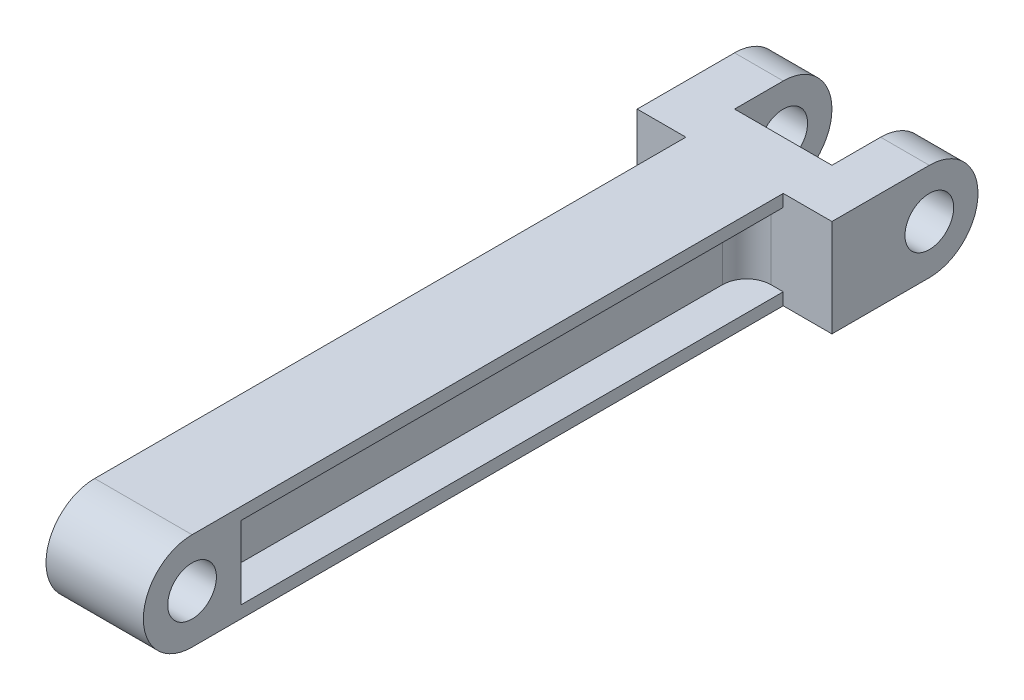
ISO-10303-21;
HEADER;
FILE_DESCRIPTION(('STEP AP214'),'2;1');
FILE_NAME('part.step','',(''),(''),'','','');
FILE_SCHEMA(('AUTOMOTIVE_DESIGN { 1 0 10303 214 1 1 1 1 }'));
ENDSEC;
DATA;
#1=APPLICATION_CONTEXT('core data for automotive mechanical design processes');
#2=APPLICATION_PROTOCOL_DEFINITION('international standard','automotive_design',2000,#1);
#3=PRODUCT_CONTEXT('',#1,'mechanical');
#4=PRODUCT('Part','Part','',(#3));
#5=PRODUCT_RELATED_PRODUCT_CATEGORY('part','',(#4));
#6=PRODUCT_DEFINITION_FORMATION('','',#4);
#7=PRODUCT_DEFINITION_CONTEXT('part definition',#1,'design');
#8=PRODUCT_DEFINITION('design','',#6,#7);
#9=PRODUCT_DEFINITION_SHAPE('','',#8);
#10=(LENGTH_UNIT() NAMED_UNIT(*) SI_UNIT(.MILLI.,.METRE.));
#11=(NAMED_UNIT(*) PLANE_ANGLE_UNIT() SI_UNIT($,.RADIAN.));
#12=(NAMED_UNIT(*) SI_UNIT($,.STERADIAN.) SOLID_ANGLE_UNIT());
#13=UNCERTAINTY_MEASURE_WITH_UNIT(LENGTH_MEASURE(1.E-05),#10,'distance_accuracy_value','');
#14=(GEOMETRIC_REPRESENTATION_CONTEXT(3) GLOBAL_UNCERTAINTY_ASSIGNED_CONTEXT((#13)) GLOBAL_UNIT_ASSIGNED_CONTEXT((#10,
#11,#12)) REPRESENTATION_CONTEXT('',''));
#15=CARTESIAN_POINT('',(0.,0.,0.));
#16=DIRECTION('',(0.,0.,1.));
#17=DIRECTION('',(1.,0.,0.));
#18=AXIS2_PLACEMENT_3D('',#15,#16,#17);
#19=CARTESIAN_POINT('',(0.,12.7,0.));
#20=DIRECTION('',(0.,-1.,0.));
#21=DIRECTION('',(0.,0.,-1.));
#22=AXIS2_PLACEMENT_3D('',#19,#20,#21);
#23=PLANE('',#22);
#24=DIRECTION('',(0.,0.,1.));
#25=VECTOR('',#24,1.);
#26=CARTESIAN_POINT('',(7.9375,12.7,0.));
#27=LINE('',#26,#25);
#28=CARTESIAN_POINT('',(7.9375,12.7,-89.8025612106915));
#29=VERTEX_POINT('',#28);
#30=CARTESIAN_POINT('',(7.9375,12.7,-83.4525612106915));
#31=VERTEX_POINT('',#30);
#32=EDGE_CURVE('E316',#29,#31,#27,.T.);
#33=ORIENTED_EDGE('',*,*,#32,.T.);
#34=DIRECTION('',(1.,0.,0.));
#35=VECTOR('',#34,1.);
#36=CARTESIAN_POINT('',(-11.1125,12.7,-83.4525612106915));
#37=LINE('',#36,#35);
#38=CARTESIAN_POINT('',(-4.7625,12.7,-83.4525612106915));
#39=VERTEX_POINT('',#38);
#40=EDGE_CURVE('E429',#39,#31,#37,.T.);
#41=ORIENTED_EDGE('',*,*,#40,.F.);
#42=DIRECTION('',(0.,0.,1.));
#43=VECTOR('',#42,1.);
#44=CARTESIAN_POINT('',(-4.7625,12.7,0.));
#45=LINE('',#44,#43);
#46=CARTESIAN_POINT('',(-4.7625,12.7,-89.8025612106915));
#47=VERTEX_POINT('',#46);
#48=EDGE_CURVE('E390',#47,#39,#45,.T.);
#49=ORIENTED_EDGE('',*,*,#48,.F.);
#50=DIRECTION('',(1.,0.,0.));
#51=VECTOR('',#50,1.);
#52=CARTESIAN_POINT('',(-29.0730122421383,12.7,-89.8025612106915));
#53=LINE('',#52,#51);
#54=CARTESIAN_POINT('',(-11.1125,12.7,-89.8025612106915));
#55=VERTEX_POINT('',#54);
#56=EDGE_CURVE('E373',#55,#47,#53,.T.);
#57=ORIENTED_EDGE('',*,*,#56,.F.);
#58=DIRECTION('',(0.,0.,1.));
#59=VECTOR('',#58,1.);
#60=CARTESIAN_POINT('',(-11.1125,12.7,0.));
#61=LINE('',#60,#59);
#62=CARTESIAN_POINT('',(-11.1125,12.7,-77.1025612106915));
#63=VERTEX_POINT('',#62);
#64=EDGE_CURVE('E419',#55,#63,#61,.T.);
#65=ORIENTED_EDGE('',*,*,#64,.T.);
#66=DIRECTION('',(1.,0.,0.));
#67=VECTOR('',#66,1.);
#68=CARTESIAN_POINT('',(-11.1125,12.7,-77.1025612106915));
#69=LINE('',#68,#67);
#70=CARTESIAN_POINT('',(-4.7625,12.7,-77.1025612106915));
#71=VERTEX_POINT('',#70);
#72=EDGE_CURVE('E424',#63,#71,#69,.T.);
#73=ORIENTED_EDGE('',*,*,#72,.T.);
#74=DIRECTION('',(0.,0.,1.));
#75=VECTOR('',#74,1.);
#76=CARTESIAN_POINT('',(-4.7625,12.7,0.));
#77=LINE('',#76,#75);
#78=CARTESIAN_POINT('',(-4.7625,12.7,0.));
#79=VERTEX_POINT('',#78);
#80=EDGE_CURVE('E452',#71,#79,#77,.T.);
#81=ORIENTED_EDGE('',*,*,#80,.T.);
#82=DIRECTION('',(1.,0.,0.));
#83=VECTOR('',#82,1.);
#84=CARTESIAN_POINT('',(0.,12.7,0.));
#85=LINE('',#84,#83);
#86=CARTESIAN_POINT('',(7.9375,12.7,0.));
#87=VERTEX_POINT('',#86);
#88=EDGE_CURVE('E251',#79,#87,#85,.T.);
#89=ORIENTED_EDGE('',*,*,#88,.T.);
#90=DIRECTION('',(0.,0.,1.));
#91=VECTOR('',#90,1.);
#92=CARTESIAN_POINT('',(7.9375,12.7,0.));
#93=LINE('',#92,#91);
#94=CARTESIAN_POINT('',(7.9375,12.7,-77.1025612106915));
#95=VERTEX_POINT('',#94);
#96=EDGE_CURVE('E245',#95,#87,#93,.T.);
#97=ORIENTED_EDGE('',*,*,#96,.F.);
#98=DIRECTION('',(-1.,0.,0.));
#99=VECTOR('',#98,1.);
#100=CARTESIAN_POINT('',(14.2875,12.7,-77.1025612106915));
#101=LINE('',#100,#99);
#102=CARTESIAN_POINT('',(14.2875,12.7,-77.1025612106915));
#103=VERTEX_POINT('',#102);
#104=EDGE_CURVE('E248',#103,#95,#101,.T.);
#105=ORIENTED_EDGE('',*,*,#104,.F.);
#106=DIRECTION('',(0.,0.,1.));
#107=VECTOR('',#106,1.);
#108=CARTESIAN_POINT('',(14.2875,12.7,0.));
#109=LINE('',#108,#107);
#110=CARTESIAN_POINT('',(14.2875,12.7,-89.8025612106915));
#111=VERTEX_POINT('',#110);
#112=EDGE_CURVE('E326',#111,#103,#109,.T.);
#113=ORIENTED_EDGE('',*,*,#112,.F.);
#114=DIRECTION('',(-1.,0.,0.));
#115=VECTOR('',#114,1.);
#116=CARTESIAN_POINT('',(44.9480122421383,12.7,-89.8025612106915));
#117=LINE('',#116,#115);
#118=EDGE_CURVE('E301',#111,#29,#117,.T.);
#119=ORIENTED_EDGE('',*,*,#118,.T.);
#120=EDGE_LOOP('',(#33,#41,#49,#57,#65,#73,#81,#89,#97,#105,#113,#119));
#121=FACE_BOUND('',#120,.T.);
#122=ADVANCED_FACE('F83',(#121),#23,.F.);
#123=CARTESIAN_POINT('',(0.,0.,0.));
#124=DIRECTION('',(0.,-1.,0.));
#125=DIRECTION('',(0.,0.,-1.));
#126=AXIS2_PLACEMENT_3D('',#123,#124,#125);
#127=PLANE('',#126);
#128=DIRECTION('',(1.,0.,0.));
#129=VECTOR('',#128,1.);
#130=CARTESIAN_POINT('',(-11.1125,0.,-83.4525612106915));
#131=LINE('',#130,#129);
#132=CARTESIAN_POINT('',(-4.7625,0.,-83.4525612106915));
#133=VERTEX_POINT('',#132);
#134=CARTESIAN_POINT('',(7.9375,0.,-83.4525612106915));
#135=VERTEX_POINT('',#134);
#136=EDGE_CURVE('E432',#133,#135,#131,.T.);
#137=ORIENTED_EDGE('',*,*,#136,.T.);
#138=DIRECTION('',(0.,0.,-1.));
#139=VECTOR('',#138,1.);
#140=CARTESIAN_POINT('',(7.9375,0.,0.));
#141=LINE('',#140,#139);
#142=CARTESIAN_POINT('',(7.9375,0.,-89.8025612106915));
#143=VERTEX_POINT('',#142);
#144=EDGE_CURVE('E308',#135,#143,#141,.T.);
#145=ORIENTED_EDGE('',*,*,#144,.T.);
#146=DIRECTION('',(-1.,0.,0.));
#147=VECTOR('',#146,1.);
#148=CARTESIAN_POINT('',(44.9480122421383,0.,-89.8025612106915));
#149=LINE('',#148,#147);
#150=CARTESIAN_POINT('',(14.2875,0.,-89.8025612106915));
#151=VERTEX_POINT('',#150);
#152=EDGE_CURVE('E319',#151,#143,#149,.T.);
#153=ORIENTED_EDGE('',*,*,#152,.F.);
#154=DIRECTION('',(0.,0.,-1.));
#155=VECTOR('',#154,1.);
#156=CARTESIAN_POINT('',(14.2875,0.,0.));
#157=LINE('',#156,#155);
#158=CARTESIAN_POINT('',(14.2875,0.,-77.1025612106915));
#159=VERTEX_POINT('',#158);
#160=EDGE_CURVE('E270',#159,#151,#157,.T.);
#161=ORIENTED_EDGE('',*,*,#160,.F.);
#162=DIRECTION('',(-1.,0.,0.));
#163=VECTOR('',#162,1.);
#164=CARTESIAN_POINT('',(14.2875,0.,-77.1025612106915));
#165=LINE('',#164,#163);
#166=CARTESIAN_POINT('',(7.9375,0.,-77.1025612106915));
#167=VERTEX_POINT('',#166);
#168=EDGE_CURVE('E269',#159,#167,#165,.T.);
#169=ORIENTED_EDGE('',*,*,#168,.T.);
#170=DIRECTION('',(0.,0.,-1.));
#171=VECTOR('',#170,1.);
#172=CARTESIAN_POINT('',(7.9375,0.,0.));
#173=LINE('',#172,#171);
#174=CARTESIAN_POINT('',(7.9375,0.,0.));
#175=VERTEX_POINT('',#174);
#176=EDGE_CURVE('E341',#175,#167,#173,.T.);
#177=ORIENTED_EDGE('',*,*,#176,.F.);
#178=DIRECTION('',(1.,0.,0.));
#179=VECTOR('',#178,1.);
#180=CARTESIAN_POINT('',(0.,0.,0.));
#181=LINE('',#180,#179);
#182=CARTESIAN_POINT('',(-4.7625,0.,0.));
#183=VERTEX_POINT('',#182);
#184=EDGE_CURVE('E455',#183,#175,#181,.T.);
#185=ORIENTED_EDGE('',*,*,#184,.F.);
#186=DIRECTION('',(0.,0.,-1.));
#187=VECTOR('',#186,1.);
#188=CARTESIAN_POINT('',(-4.7625,0.,0.));
#189=LINE('',#188,#187);
#190=CARTESIAN_POINT('',(-4.7625,0.,-77.1025612106915));
#191=VERTEX_POINT('',#190);
#192=EDGE_CURVE('E445',#183,#191,#189,.T.);
#193=ORIENTED_EDGE('',*,*,#192,.T.);
#194=DIRECTION('',(1.,0.,0.));
#195=VECTOR('',#194,1.);
#196=CARTESIAN_POINT('',(-11.1125,0.,-77.1025612106915));
#197=LINE('',#196,#195);
#198=CARTESIAN_POINT('',(-11.1125,0.,-77.1025612106915));
#199=VERTEX_POINT('',#198);
#200=EDGE_CURVE('E423',#199,#191,#197,.T.);
#201=ORIENTED_EDGE('',*,*,#200,.F.);
#202=DIRECTION('',(0.,0.,-1.));
#203=VECTOR('',#202,1.);
#204=CARTESIAN_POINT('',(-11.1125,0.,0.));
#205=LINE('',#204,#203);
#206=CARTESIAN_POINT('',(-11.1125,0.,-89.8025612106915));
#207=VERTEX_POINT('',#206);
#208=EDGE_CURVE('E416',#199,#207,#205,.T.);
#209=ORIENTED_EDGE('',*,*,#208,.T.);
#210=DIRECTION('',(1.,0.,0.));
#211=VECTOR('',#210,1.);
#212=CARTESIAN_POINT('',(-29.0730122421383,0.,-89.8025612106915));
#213=LINE('',#212,#211);
#214=CARTESIAN_POINT('',(-4.7625,0.,-89.8025612106915));
#215=VERTEX_POINT('',#214);
#216=EDGE_CURVE('E405',#207,#215,#213,.T.);
#217=ORIENTED_EDGE('',*,*,#216,.T.);
#218=DIRECTION('',(0.,0.,-1.));
#219=VECTOR('',#218,1.);
#220=CARTESIAN_POINT('',(-4.7625,0.,0.));
#221=LINE('',#220,#219);
#222=EDGE_CURVE('E382',#133,#215,#221,.T.);
#223=ORIENTED_EDGE('',*,*,#222,.F.);
#224=EDGE_LOOP('',(#137,#145,#153,#161,#169,#177,#185,#193,#201,#209,#217,#223));
#225=FACE_BOUND('',#224,.T.);
#226=ADVANCED_FACE('F546',(#225),#127,.T.);
#227=CARTESIAN_POINT('',(3.175,12.7,0.));
#228=DIRECTION('',(1.,0.,0.));
#229=DIRECTION('',(0.,0.,-1.));
#230=AXIS2_PLACEMENT_3D('',#227,#228,#229);
#231=PLANE('',#230);
#232=DIRECTION('',(0.,0.,1.));
#233=VECTOR('',#232,1.);
#234=CARTESIAN_POINT('',(3.175,11.1125,-82.1226769962089));
#235=LINE('',#234,#233);
#236=CARTESIAN_POINT('',(3.175,11.1125,-73.9275612106916));
#237=VERTEX_POINT('',#236);
#238=CARTESIAN_POINT('',(3.175,11.1125,-9.52500000000001));
#239=VERTEX_POINT('',#238);
#240=EDGE_CURVE('E292',#237,#239,#235,.T.);
#241=ORIENTED_EDGE('',*,*,#240,.T.);
#242=DIRECTION('',(0.,1.,0.));
#243=VECTOR('',#242,1.);
#244=CARTESIAN_POINT('',(3.175,1.5875,-9.525));
#245=LINE('',#244,#243);
#246=CARTESIAN_POINT('',(3.175,1.5875,-9.52499999999999));
#247=VERTEX_POINT('',#246);
#248=EDGE_CURVE('E92',#239,#247,#245,.F.);
#249=ORIENTED_EDGE('',*,*,#248,.T.);
#250=DIRECTION('',(0.,0.,1.));
#251=VECTOR('',#250,1.);
#252=CARTESIAN_POINT('',(3.175,1.58749999999999,-82.1226769962089));
#253=LINE('',#252,#251);
#254=CARTESIAN_POINT('',(3.175,1.58749999999999,-73.9275612106916));
#255=VERTEX_POINT('',#254);
#256=EDGE_CURVE('E520',#255,#247,#253,.T.);
#257=ORIENTED_EDGE('',*,*,#256,.F.);
#258=DIRECTION('',(0.,-1.,0.));
#259=VECTOR('',#258,1.);
#260=CARTESIAN_POINT('',(3.175,11.1125,-73.9275612106916));
#261=LINE('',#260,#259);
#262=EDGE_CURVE('E493',#255,#237,#261,.F.);
#263=ORIENTED_EDGE('',*,*,#262,.T.);
#264=EDGE_LOOP('',(#241,#249,#257,#263));
#265=FACE_BOUND('',#264,.T.);
#266=ADVANCED_FACE('F535',(#265),#231,.T.);
#267=CARTESIAN_POINT('',(0.,12.7,0.));
#268=DIRECTION('',(1.,0.,0.));
#269=DIRECTION('',(0.,0.,-1.));
#270=AXIS2_PLACEMENT_3D('',#267,#268,#269);
#271=PLANE('',#270);
#272=DIRECTION('',(0.,0.,1.));
#273=VECTOR('',#272,1.);
#274=CARTESIAN_POINT('',(0.,1.58749999999999,-82.1226769962089));
#275=LINE('',#274,#273);
#276=CARTESIAN_POINT('',(0.,1.58749999999999,-73.9275612106916));
#277=VERTEX_POINT('',#276);
#278=CARTESIAN_POINT('',(0.,1.5875,-9.52499999999999));
#279=VERTEX_POINT('',#278);
#280=EDGE_CURVE('E344',#277,#279,#275,.T.);
#281=ORIENTED_EDGE('',*,*,#280,.T.);
#282=DIRECTION('',(0.,-1.,0.));
#283=VECTOR('',#282,1.);
#284=CARTESIAN_POINT('',(0.,11.1125,-9.525));
#285=LINE('',#284,#283);
#286=CARTESIAN_POINT('',(0.,11.1125,-9.52500000000001));
#287=VERTEX_POINT('',#286);
#288=EDGE_CURVE('E480',#279,#287,#285,.F.);
#289=ORIENTED_EDGE('',*,*,#288,.T.);
#290=DIRECTION('',(0.,0.,1.));
#291=VECTOR('',#290,1.);
#292=CARTESIAN_POINT('',(0.,11.1125,-82.1226769962089));
#293=LINE('',#292,#291);
#294=CARTESIAN_POINT('',(0.,11.1125,-73.9275612106916));
#295=VERTEX_POINT('',#294);
#296=EDGE_CURVE('E368',#295,#287,#293,.T.);
#297=ORIENTED_EDGE('',*,*,#296,.F.);
#298=DIRECTION('',(0.,1.,0.));
#299=VECTOR('',#298,1.);
#300=CARTESIAN_POINT('',(0.,1.58749999999999,-73.9275612106916));
#301=LINE('',#300,#299);
#302=EDGE_CURVE('E467',#295,#277,#301,.F.);
#303=ORIENTED_EDGE('',*,*,#302,.T.);
#304=EDGE_LOOP('',(#281,#289,#297,#303));
#305=FACE_BOUND('',#304,.T.);
#306=ADVANCED_FACE('F557',(#305),#271,.F.);
#307=CARTESIAN_POINT('',(-4.7625,0.,-6.35));
#308=DIRECTION('',(0.,0.,1.));
#309=DIRECTION('',(0.,-1.,0.));
#310=AXIS2_PLACEMENT_3D('',#307,#308,#309);
#311=PLANE('',#310);
#312=DIRECTION('',(-1.,0.,0.));
#313=VECTOR('',#312,1.);
#314=CARTESIAN_POINT('',(-4.7625,11.1125,-6.35));
#315=LINE('',#314,#313);
#316=CARTESIAN_POINT('',(-3.175,11.1125,-6.35));
#317=VERTEX_POINT('',#316);
#318=CARTESIAN_POINT('',(-4.7625,11.1125,-6.35));
#319=VERTEX_POINT('',#318);
#320=EDGE_CURVE('E364',#317,#319,#315,.T.);
#321=ORIENTED_EDGE('',*,*,#320,.F.);
#322=DIRECTION('',(0.,-1.,0.));
#323=VECTOR('',#322,1.);
#324=CARTESIAN_POINT('',(-3.175,1.5875,-6.35));
#325=LINE('',#324,#323);
#326=CARTESIAN_POINT('',(-3.175,1.5875,-6.35));
#327=VERTEX_POINT('',#326);
#328=EDGE_CURVE('E473',#317,#327,#325,.T.);
#329=ORIENTED_EDGE('',*,*,#328,.T.);
#330=DIRECTION('',(1.,0.,0.));
#331=VECTOR('',#330,1.);
#332=CARTESIAN_POINT('',(0.,1.5875,-6.35));
#333=LINE('',#332,#331);
#334=CARTESIAN_POINT('',(-4.7625,1.5875,-6.35));
#335=VERTEX_POINT('',#334);
#336=EDGE_CURVE('E345',#335,#327,#333,.T.);
#337=ORIENTED_EDGE('',*,*,#336,.F.);
#338=DIRECTION('',(0.,-1.,0.));
#339=VECTOR('',#338,1.);
#340=CARTESIAN_POINT('',(-4.7625,0.,-6.35));
#341=LINE('',#340,#339);
#342=EDGE_CURVE('E448',#319,#335,#341,.T.);
#343=ORIENTED_EDGE('',*,*,#342,.F.);
#344=EDGE_LOOP('',(#321,#329,#337,#343));
#345=FACE_BOUND('',#344,.T.);
#346=ADVANCED_FACE('F560',(#345),#311,.F.);
#347=CARTESIAN_POINT('',(-11.1125,0.,-77.1025612106915));
#348=DIRECTION('',(0.,0.,-1.));
#349=DIRECTION('',(-1.,0.,0.));
#350=AXIS2_PLACEMENT_3D('',#347,#348,#349);
#351=PLANE('',#350);
#352=DIRECTION('',(1.,0.,0.));
#353=VECTOR('',#352,1.);
#354=CARTESIAN_POINT('',(0.,1.58749999999999,-77.1025612106915));
#355=LINE('',#354,#353);
#356=CARTESIAN_POINT('',(-4.7625,1.58749999999999,-77.1025612106915));
#357=VERTEX_POINT('',#356);
#358=CARTESIAN_POINT('',(-3.175,1.58749999999999,-77.1025612106915));
#359=VERTEX_POINT('',#358);
#360=EDGE_CURVE('E349',#357,#359,#355,.T.);
#361=ORIENTED_EDGE('',*,*,#360,.T.);
#362=DIRECTION('',(0.,1.,0.));
#363=VECTOR('',#362,1.);
#364=CARTESIAN_POINT('',(-3.175,11.1125,-77.1025612106915));
#365=LINE('',#364,#363);
#366=CARTESIAN_POINT('',(-3.175,11.1125,-77.1025612106915));
#367=VERTEX_POINT('',#366);
#368=EDGE_CURVE('E458',#359,#367,#365,.T.);
#369=ORIENTED_EDGE('',*,*,#368,.T.);
#370=DIRECTION('',(-1.,0.,0.));
#371=VECTOR('',#370,1.);
#372=CARTESIAN_POINT('',(-4.7625,11.1125,-77.1025612106915));
#373=LINE('',#372,#371);
#374=CARTESIAN_POINT('',(-4.7625,11.1125,-77.1025612106915));
#375=VERTEX_POINT('',#374);
#376=EDGE_CURVE('E367',#367,#375,#373,.T.);
#377=ORIENTED_EDGE('',*,*,#376,.T.);
#378=DIRECTION('',(0.,1.,0.));
#379=VECTOR('',#378,1.);
#380=CARTESIAN_POINT('',(-4.7625,12.7,-77.1025612106915));
#381=LINE('',#380,#379);
#382=EDGE_CURVE('E369',#375,#71,#381,.T.);
#383=ORIENTED_EDGE('',*,*,#382,.T.);
#384=ORIENTED_EDGE('',*,*,#72,.F.);
#385=DIRECTION('',(0.,1.,0.));
#386=VECTOR('',#385,1.);
#387=CARTESIAN_POINT('',(-11.1125,0.,-77.1025612106915));
#388=LINE('',#387,#386);
#389=EDGE_CURVE('E413',#199,#63,#388,.T.);
#390=ORIENTED_EDGE('',*,*,#389,.F.);
#391=ORIENTED_EDGE('',*,*,#200,.T.);
#392=DIRECTION('',(0.,1.,0.));
#393=VECTOR('',#392,1.);
#394=CARTESIAN_POINT('',(-4.7625,0.,-77.1025612106915));
#395=LINE('',#394,#393);
#396=EDGE_CURVE('E351',#191,#357,#395,.T.);
#397=ORIENTED_EDGE('',*,*,#396,.T.);
#398=EDGE_LOOP('',(#361,#369,#377,#383,#384,#390,#391,#397));
#399=FACE_BOUND('',#398,.T.);
#400=ADVANCED_FACE('F591',(#399),#351,.F.);
#401=CARTESIAN_POINT('',(-4.7625,6.35,0.));
#402=DIRECTION('',(1.,0.,0.));
#403=DIRECTION('',(0.,0.,-1.));
#404=AXIS2_PLACEMENT_3D('',#401,#402,#403);
#405=CYLINDRICAL_SURFACE('',#404,3.175);
#406=CARTESIAN_POINT('',(7.9375,6.35,0.));
#407=DIRECTION('',(1.,0.,0.));
#408=DIRECTION('',(0.,0.,-1.));
#409=AXIS2_PLACEMENT_3D('',#406,#407,#408);
#410=CIRCLE('',#409,3.175);
#411=CARTESIAN_POINT('',(7.9375,6.35,-3.175));
#412=VERTEX_POINT('',#411);
#413=EDGE_CURVE('E332',#412,#412,#410,.T.);
#414=ORIENTED_EDGE('',*,*,#413,.T.);
#415=EDGE_LOOP('',(#414));
#416=FACE_BOUND('',#415,.T.);
#417=CARTESIAN_POINT('',(-4.7625,6.35,0.));
#418=DIRECTION('',(1.,0.,0.));
#419=DIRECTION('',(0.,0.,-1.));
#420=AXIS2_PLACEMENT_3D('',#417,#418,#419);
#421=CIRCLE('',#420,3.175);
#422=CARTESIAN_POINT('',(-4.7625,6.35,-3.175));
#423=VERTEX_POINT('',#422);
#424=EDGE_CURVE('E428',#423,#423,#421,.T.);
#425=ORIENTED_EDGE('',*,*,#424,.F.);
#426=EDGE_LOOP('',(#425));
#427=FACE_BOUND('',#426,.T.);
#428=ADVANCED_FACE('F554',(#416,#427),#405,.F.);
#429=CARTESIAN_POINT('',(-4.7625,6.35,0.));
#430=DIRECTION('',(1.,0.,0.));
#431=DIRECTION('',(0.,0.,-1.));
#432=AXIS2_PLACEMENT_3D('',#429,#430,#431);
#433=CYLINDRICAL_SURFACE('',#432,6.35);
#434=ORIENTED_EDGE('',*,*,#184,.T.);
#435=CARTESIAN_POINT('',(7.9375,6.35,0.));
#436=DIRECTION('',(1.,0.,0.));
#437=DIRECTION('',(0.,0.,-1.));
#438=AXIS2_PLACEMENT_3D('',#435,#436,#437);
#439=CIRCLE('',#438,6.35);
#440=EDGE_CURVE('E258',#87,#175,#439,.T.);
#441=ORIENTED_EDGE('',*,*,#440,.F.);
#442=ORIENTED_EDGE('',*,*,#88,.F.);
#443=CARTESIAN_POINT('',(-4.7625,6.35,0.));
#444=DIRECTION('',(1.,0.,0.));
#445=DIRECTION('',(0.,0.,-1.));
#446=AXIS2_PLACEMENT_3D('',#443,#444,#445);
#447=CIRCLE('',#446,6.35);
#448=EDGE_CURVE('E441',#79,#183,#447,.T.);
#449=ORIENTED_EDGE('',*,*,#448,.T.);
#450=EDGE_LOOP('',(#434,#441,#442,#449));
#451=FACE_BOUND('',#450,.T.);
#452=ADVANCED_FACE('F605',(#451),#433,.T.);
#453=CARTESIAN_POINT('',(-4.7625,0.,0.));
#454=DIRECTION('',(1.,0.,0.));
#455=DIRECTION('',(0.,0.,-1.));
#456=AXIS2_PLACEMENT_3D('',#453,#454,#455);
#457=PLANE('',#456);
#458=ORIENTED_EDGE('',*,*,#424,.T.);
#459=EDGE_LOOP('',(#458));
#460=FACE_BOUND('',#459,.T.);
#461=ORIENTED_EDGE('',*,*,#448,.F.);
#462=ORIENTED_EDGE('',*,*,#80,.F.);
#463=ORIENTED_EDGE('',*,*,#382,.F.);
#464=DIRECTION('',(0.,0.,1.));
#465=VECTOR('',#464,1.);
#466=CARTESIAN_POINT('',(-4.7625,11.1125,-82.1226769962089));
#467=LINE('',#466,#465);
#468=EDGE_CURVE('E355',#375,#319,#467,.T.);
#469=ORIENTED_EDGE('',*,*,#468,.T.);
#470=ORIENTED_EDGE('',*,*,#342,.T.);
#471=DIRECTION('',(0.,0.,1.));
#472=VECTOR('',#471,1.);
#473=CARTESIAN_POINT('',(-4.7625,1.58749999999999,-82.1226769962089));
#474=LINE('',#473,#472);
#475=EDGE_CURVE('E350',#357,#335,#474,.T.);
#476=ORIENTED_EDGE('',*,*,#475,.F.);
#477=ORIENTED_EDGE('',*,*,#396,.F.);
#478=ORIENTED_EDGE('',*,*,#192,.F.);
#479=EDGE_LOOP('',(#461,#462,#463,#469,#470,#476,#477,#478));
#480=FACE_BOUND('',#479,.T.);
#481=ADVANCED_FACE('F588',(#460,#480),#457,.F.);
#482=CARTESIAN_POINT('',(-11.1125,0.,-83.4525612106915));
#483=DIRECTION('',(0.,0.,1.));
#484=DIRECTION('',(1.,0.,0.));
#485=AXIS2_PLACEMENT_3D('',#482,#483,#484);
#486=PLANE('',#485);
#487=ORIENTED_EDGE('',*,*,#136,.F.);
#488=DIRECTION('',(0.,-1.,0.));
#489=VECTOR('',#488,1.);
#490=CARTESIAN_POINT('',(-4.7625,0.,-83.4525612106915));
#491=LINE('',#490,#489);
#492=EDGE_CURVE('E387',#39,#133,#491,.T.);
#493=ORIENTED_EDGE('',*,*,#492,.F.);
#494=ORIENTED_EDGE('',*,*,#40,.T.);
#495=DIRECTION('',(0.,-1.,0.));
#496=VECTOR('',#495,1.);
#497=CARTESIAN_POINT('',(7.9375,0.,-83.4525612106915));
#498=LINE('',#497,#496);
#499=EDGE_CURVE('E312',#31,#135,#498,.T.);
#500=ORIENTED_EDGE('',*,*,#499,.T.);
#501=EDGE_LOOP('',(#487,#493,#494,#500));
#502=FACE_BOUND('',#501,.T.);
#503=ADVANCED_FACE('F621',(#502),#486,.F.);
#504=CARTESIAN_POINT('',(-11.1125,0.,0.));
#505=DIRECTION('',(1.,0.,0.));
#506=DIRECTION('',(0.,0.,-1.));
#507=AXIS2_PLACEMENT_3D('',#504,#505,#506);
#508=PLANE('',#507);
#509=ORIENTED_EDGE('',*,*,#389,.T.);
#510=ORIENTED_EDGE('',*,*,#64,.F.);
#511=CARTESIAN_POINT('',(-11.1125,6.35,-89.8025612106915));
#512=DIRECTION('',(1.,0.,0.));
#513=DIRECTION('',(0.,0.,-1.));
#514=AXIS2_PLACEMENT_3D('',#511,#512,#513);
#515=CIRCLE('',#514,6.35);
#516=EDGE_CURVE('E386',#55,#207,#515,.F.);
#517=ORIENTED_EDGE('',*,*,#516,.T.);
#518=ORIENTED_EDGE('',*,*,#208,.F.);
#519=EDGE_LOOP('',(#509,#510,#517,#518));
#520=FACE_BOUND('',#519,.T.);
#521=CARTESIAN_POINT('',(-11.1125,6.35,-89.8025612106915));
#522=DIRECTION('',(1.,0.,0.));
#523=DIRECTION('',(0.,0.,-1.));
#524=AXIS2_PLACEMENT_3D('',#521,#522,#523);
#525=CIRCLE('',#524,3.175);
#526=CARTESIAN_POINT('',(-11.1125,6.35,-92.9775612106915));
#527=VERTEX_POINT('',#526);
#528=EDGE_CURVE('E401',#527,#527,#525,.F.);
#529=ORIENTED_EDGE('',*,*,#528,.F.);
#530=EDGE_LOOP('',(#529));
#531=FACE_BOUND('',#530,.T.);
#532=ADVANCED_FACE('F610',(#520,#531),#508,.F.);
#533=CARTESIAN_POINT('',(-29.0730122421383,6.35,-89.8025612106915));
#534=DIRECTION('',(1.,0.,0.));
#535=DIRECTION('',(0.,0.,-1.));
#536=AXIS2_PLACEMENT_3D('',#533,#534,#535);
#537=CYLINDRICAL_SURFACE('',#536,6.35);
#538=ORIENTED_EDGE('',*,*,#516,.F.);
#539=ORIENTED_EDGE('',*,*,#56,.T.);
#540=CARTESIAN_POINT('',(-4.7625,6.35,-89.8025612106915));
#541=DIRECTION('',(1.,0.,0.));
#542=DIRECTION('',(0.,0.,-1.));
#543=AXIS2_PLACEMENT_3D('',#540,#541,#542);
#544=CIRCLE('',#543,6.35);
#545=EDGE_CURVE('E393',#215,#47,#544,.T.);
#546=ORIENTED_EDGE('',*,*,#545,.F.);
#547=ORIENTED_EDGE('',*,*,#216,.F.);
#548=EDGE_LOOP('',(#538,#539,#546,#547));
#549=FACE_BOUND('',#548,.T.);
#550=ADVANCED_FACE('F614',(#549),#537,.T.);
#551=CARTESIAN_POINT('',(-29.0730122421383,6.35,-89.8025612106915));
#552=DIRECTION('',(1.,0.,0.));
#553=DIRECTION('',(0.,0.,-1.));
#554=AXIS2_PLACEMENT_3D('',#551,#552,#553);
#555=CYLINDRICAL_SURFACE('',#554,3.175);
#556=ORIENTED_EDGE('',*,*,#528,.T.);
#557=EDGE_LOOP('',(#556));
#558=FACE_BOUND('',#557,.T.);
#559=CARTESIAN_POINT('',(-4.7625,6.35,-89.8025612106915));
#560=DIRECTION('',(1.,0.,0.));
#561=DIRECTION('',(0.,0.,-1.));
#562=AXIS2_PLACEMENT_3D('',#559,#560,#561);
#563=CIRCLE('',#562,3.175);
#564=CARTESIAN_POINT('',(-4.7625,6.35,-92.9775612106915));
#565=VERTEX_POINT('',#564);
#566=EDGE_CURVE('E397',#565,#565,#563,.T.);
#567=ORIENTED_EDGE('',*,*,#566,.T.);
#568=EDGE_LOOP('',(#567));
#569=FACE_BOUND('',#568,.T.);
#570=ADVANCED_FACE('F640',(#558,#569),#555,.F.);
#571=CARTESIAN_POINT('',(-4.7625,0.,0.));
#572=DIRECTION('',(1.,0.,0.));
#573=DIRECTION('',(0.,0.,-1.));
#574=AXIS2_PLACEMENT_3D('',#571,#572,#573);
#575=PLANE('',#574);
#576=ORIENTED_EDGE('',*,*,#566,.F.);
#577=EDGE_LOOP('',(#576));
#578=FACE_BOUND('',#577,.T.);
#579=ORIENTED_EDGE('',*,*,#545,.T.);
#580=ORIENTED_EDGE('',*,*,#48,.T.);
#581=ORIENTED_EDGE('',*,*,#492,.T.);
#582=ORIENTED_EDGE('',*,*,#222,.T.);
#583=EDGE_LOOP('',(#579,#580,#581,#582));
#584=FACE_BOUND('',#583,.T.);
#585=ADVANCED_FACE('F638',(#578,#584),#575,.T.);
#586=CARTESIAN_POINT('',(-4.7625,11.1125,-82.1226769962089));
#587=DIRECTION('',(0.,1.,0.));
#588=DIRECTION('',(0.,0.,1.));
#589=AXIS2_PLACEMENT_3D('',#586,#587,#588);
#590=PLANE('',#589);
#591=ORIENTED_EDGE('',*,*,#296,.T.);
#592=CARTESIAN_POINT('',(-3.175,11.1125,-9.525));
#593=DIRECTION('',(0.,1.,0.));
#594=DIRECTION('',(0.,0.,1.));
#595=AXIS2_PLACEMENT_3D('',#592,#593,#594);
#596=CIRCLE('',#595,3.175);
#597=EDGE_CURVE('E483',#287,#317,#596,.F.);
#598=ORIENTED_EDGE('',*,*,#597,.T.);
#599=ORIENTED_EDGE('',*,*,#320,.T.);
#600=ORIENTED_EDGE('',*,*,#468,.F.);
#601=ORIENTED_EDGE('',*,*,#376,.F.);
#602=CARTESIAN_POINT('',(-3.175,11.1125,-73.9275612106916));
#603=DIRECTION('',(0.,1.,0.));
#604=DIRECTION('',(0.,0.,1.));
#605=AXIS2_PLACEMENT_3D('',#602,#603,#604);
#606=CIRCLE('',#605,3.175);
#607=EDGE_CURVE('E464',#367,#295,#606,.F.);
#608=ORIENTED_EDGE('',*,*,#607,.T.);
#609=EDGE_LOOP('',(#591,#598,#599,#600,#601,#608));
#610=FACE_BOUND('',#609,.T.);
#611=ADVANCED_FACE('F579',(#610),#590,.F.);
#612=CARTESIAN_POINT('',(0.,1.58749999999999,-82.1226769962089));
#613=DIRECTION('',(0.,-1.,0.));
#614=DIRECTION('',(0.,0.,-1.));
#615=AXIS2_PLACEMENT_3D('',#612,#613,#614);
#616=PLANE('',#615);
#617=ORIENTED_EDGE('',*,*,#336,.T.);
#618=CARTESIAN_POINT('',(-3.175,1.5875,-9.525));
#619=DIRECTION('',(0.,-1.,0.));
#620=DIRECTION('',(0.,0.,-1.));
#621=AXIS2_PLACEMENT_3D('',#618,#619,#620);
#622=CIRCLE('',#621,3.175);
#623=EDGE_CURVE('E477',#327,#279,#622,.F.);
#624=ORIENTED_EDGE('',*,*,#623,.T.);
#625=ORIENTED_EDGE('',*,*,#280,.F.);
#626=CARTESIAN_POINT('',(-3.175,1.58749999999999,-73.9275612106916));
#627=DIRECTION('',(0.,-1.,0.));
#628=DIRECTION('',(0.,0.,-1.));
#629=AXIS2_PLACEMENT_3D('',#626,#627,#628);
#630=CIRCLE('',#629,3.175);
#631=EDGE_CURVE('E470',#277,#359,#630,.F.);
#632=ORIENTED_EDGE('',*,*,#631,.T.);
#633=ORIENTED_EDGE('',*,*,#360,.F.);
#634=ORIENTED_EDGE('',*,*,#475,.T.);
#635=EDGE_LOOP('',(#617,#624,#625,#632,#633,#634));
#636=FACE_BOUND('',#635,.T.);
#637=ADVANCED_FACE('F566',(#636),#616,.F.);
#638=CARTESIAN_POINT('',(-3.175,0.,-73.9275612106916));
#639=DIRECTION('',(0.,-1.,0.));
#640=DIRECTION('',(0.,0.,-1.));
#641=AXIS2_PLACEMENT_3D('',#638,#639,#640);
#642=CYLINDRICAL_SURFACE('',#641,3.175);
#643=ORIENTED_EDGE('',*,*,#631,.F.);
#644=ORIENTED_EDGE('',*,*,#302,.F.);
#645=ORIENTED_EDGE('',*,*,#607,.F.);
#646=ORIENTED_EDGE('',*,*,#368,.F.);
#647=EDGE_LOOP('',(#643,#644,#645,#646));
#648=FACE_BOUND('',#647,.T.);
#649=ADVANCED_FACE('F562',(#648),#642,.F.);
#650=CARTESIAN_POINT('',(-3.175,0.,-9.525));
#651=DIRECTION('',(0.,1.,0.));
#652=DIRECTION('',(0.,0.,1.));
#653=AXIS2_PLACEMENT_3D('',#650,#651,#652);
#654=CYLINDRICAL_SURFACE('',#653,3.175);
#655=ORIENTED_EDGE('',*,*,#597,.F.);
#656=ORIENTED_EDGE('',*,*,#288,.F.);
#657=ORIENTED_EDGE('',*,*,#623,.F.);
#658=ORIENTED_EDGE('',*,*,#328,.F.);
#659=EDGE_LOOP('',(#655,#656,#657,#658));
#660=FACE_BOUND('',#659,.T.);
#661=ADVANCED_FACE('F565',(#660),#654,.F.);
#662=CARTESIAN_POINT('',(7.9375,0.,-6.35));
#663=DIRECTION('',(0.,0.,-1.));
#664=DIRECTION('',(0.,1.,0.));
#665=AXIS2_PLACEMENT_3D('',#662,#663,#664);
#666=PLANE('',#665);
#667=DIRECTION('',(-1.,0.,0.));
#668=VECTOR('',#667,1.);
#669=CARTESIAN_POINT('',(3.175,1.5875,-6.35));
#670=LINE('',#669,#668);
#671=CARTESIAN_POINT('',(7.9375,1.58749999999999,-6.35));
#672=VERTEX_POINT('',#671);
#673=CARTESIAN_POINT('',(6.35,1.5875,-6.35));
#674=VERTEX_POINT('',#673);
#675=EDGE_CURVE('E509',#672,#674,#670,.T.);
#676=ORIENTED_EDGE('',*,*,#675,.T.);
#677=DIRECTION('',(0.,1.,0.));
#678=VECTOR('',#677,1.);
#679=CARTESIAN_POINT('',(6.35,11.1125,-6.35));
#680=LINE('',#679,#678);
#681=CARTESIAN_POINT('',(6.35,11.1125,-6.35));
#682=VERTEX_POINT('',#681);
#683=EDGE_CURVE('E499',#674,#682,#680,.T.);
#684=ORIENTED_EDGE('',*,*,#683,.T.);
#685=DIRECTION('',(1.,0.,0.));
#686=VECTOR('',#685,1.);
#687=CARTESIAN_POINT('',(7.9375,11.1125,-6.35));
#688=LINE('',#687,#686);
#689=CARTESIAN_POINT('',(7.9375,11.1125,-6.35));
#690=VERTEX_POINT('',#689);
#691=EDGE_CURVE('E289',#682,#690,#688,.T.);
#692=ORIENTED_EDGE('',*,*,#691,.T.);
#693=DIRECTION('',(0.,-1.,0.));
#694=VECTOR('',#693,1.);
#695=CARTESIAN_POINT('',(7.9375,0.,-6.35));
#696=LINE('',#695,#694);
#697=EDGE_CURVE('E257',#690,#672,#696,.T.);
#698=ORIENTED_EDGE('',*,*,#697,.T.);
#699=EDGE_LOOP('',(#676,#684,#692,#698));
#700=FACE_BOUND('',#699,.T.);
#701=ADVANCED_FACE('F538',(#700),#666,.T.);
#702=CARTESIAN_POINT('',(7.9375,0.,0.));
#703=DIRECTION('',(-1.,0.,0.));
#704=DIRECTION('',(0.,0.,-1.));
#705=AXIS2_PLACEMENT_3D('',#702,#703,#704);
#706=PLANE('',#705);
#707=ORIENTED_EDGE('',*,*,#413,.F.);
#708=EDGE_LOOP('',(#707));
#709=FACE_BOUND('',#708,.T.);
#710=ORIENTED_EDGE('',*,*,#440,.T.);
#711=ORIENTED_EDGE('',*,*,#176,.T.);
#712=DIRECTION('',(0.,1.,0.));
#713=VECTOR('',#712,1.);
#714=CARTESIAN_POINT('',(7.9375,0.,-77.1025612106915));
#715=LINE('',#714,#713);
#716=CARTESIAN_POINT('',(7.9375,1.58749999999999,-77.1025612106915));
#717=VERTEX_POINT('',#716);
#718=EDGE_CURVE('E506',#167,#717,#715,.T.);
#719=ORIENTED_EDGE('',*,*,#718,.T.);
#720=DIRECTION('',(0.,0.,1.));
#721=VECTOR('',#720,1.);
#722=CARTESIAN_POINT('',(7.9375,1.58749999999999,-82.1226769962089));
#723=LINE('',#722,#721);
#724=EDGE_CURVE('E508',#717,#672,#723,.T.);
#725=ORIENTED_EDGE('',*,*,#724,.T.);
#726=ORIENTED_EDGE('',*,*,#697,.F.);
#727=DIRECTION('',(0.,0.,1.));
#728=VECTOR('',#727,1.);
#729=CARTESIAN_POINT('',(7.9375,11.1125,-82.1226769962089));
#730=LINE('',#729,#728);
#731=CARTESIAN_POINT('',(7.9375,11.1125,-77.1025612106915));
#732=VERTEX_POINT('',#731);
#733=EDGE_CURVE('E275',#732,#690,#730,.T.);
#734=ORIENTED_EDGE('',*,*,#733,.F.);
#735=DIRECTION('',(0.,1.,0.));
#736=VECTOR('',#735,1.);
#737=CARTESIAN_POINT('',(7.9375,12.7,-77.1025612106915));
#738=LINE('',#737,#736);
#739=EDGE_CURVE('E264',#732,#95,#738,.T.);
#740=ORIENTED_EDGE('',*,*,#739,.T.);
#741=ORIENTED_EDGE('',*,*,#96,.T.);
#742=EDGE_LOOP('',(#710,#711,#719,#725,#726,#734,#740,#741));
#743=FACE_BOUND('',#742,.T.);
#744=ADVANCED_FACE('F272',(#709,#743),#706,.F.);
#745=CARTESIAN_POINT('',(14.2875,0.,-77.1025612106915));
#746=DIRECTION('',(0.,0.,1.));
#747=DIRECTION('',(1.,0.,0.));
#748=AXIS2_PLACEMENT_3D('',#745,#746,#747);
#749=PLANE('',#748);
#750=DIRECTION('',(1.,0.,0.));
#751=VECTOR('',#750,1.);
#752=CARTESIAN_POINT('',(7.9375,11.1125,-77.1025612106915));
#753=LINE('',#752,#751);
#754=CARTESIAN_POINT('',(6.35,11.1125,-77.1025612106915));
#755=VERTEX_POINT('',#754);
#756=EDGE_CURVE('E285',#755,#732,#753,.T.);
#757=ORIENTED_EDGE('',*,*,#756,.F.);
#758=DIRECTION('',(0.,-1.,0.));
#759=VECTOR('',#758,1.);
#760=CARTESIAN_POINT('',(6.35,1.58749999999999,-77.1025612106915));
#761=LINE('',#760,#759);
#762=CARTESIAN_POINT('',(6.35,1.58749999999999,-77.1025612106915));
#763=VERTEX_POINT('',#762);
#764=EDGE_CURVE('E486',#755,#763,#761,.T.);
#765=ORIENTED_EDGE('',*,*,#764,.T.);
#766=DIRECTION('',(-1.,0.,0.));
#767=VECTOR('',#766,1.);
#768=CARTESIAN_POINT('',(3.175,1.58749999999999,-77.1025612106915));
#769=LINE('',#768,#767);
#770=EDGE_CURVE('E514',#717,#763,#769,.T.);
#771=ORIENTED_EDGE('',*,*,#770,.F.);
#772=ORIENTED_EDGE('',*,*,#718,.F.);
#773=ORIENTED_EDGE('',*,*,#168,.F.);
#774=DIRECTION('',(0.,1.,0.));
#775=VECTOR('',#774,1.);
#776=CARTESIAN_POINT('',(14.2875,0.,-77.1025612106915));
#777=LINE('',#776,#775);
#778=EDGE_CURVE('E267',#159,#103,#777,.T.);
#779=ORIENTED_EDGE('',*,*,#778,.T.);
#780=ORIENTED_EDGE('',*,*,#104,.T.);
#781=ORIENTED_EDGE('',*,*,#739,.F.);
#782=EDGE_LOOP('',(#757,#765,#771,#772,#773,#779,#780,#781));
#783=FACE_BOUND('',#782,.T.);
#784=ADVANCED_FACE('F263',(#783),#749,.T.);
#785=CARTESIAN_POINT('',(14.2875,0.,0.));
#786=DIRECTION('',(-1.,0.,0.));
#787=DIRECTION('',(0.,0.,-1.));
#788=AXIS2_PLACEMENT_3D('',#785,#786,#787);
#789=PLANE('',#788);
#790=ORIENTED_EDGE('',*,*,#778,.F.);
#791=ORIENTED_EDGE('',*,*,#160,.T.);
#792=CARTESIAN_POINT('',(14.2875,6.35,-89.8025612106915));
#793=DIRECTION('',(-1.,0.,0.));
#794=DIRECTION('',(0.,0.,1.));
#795=AXIS2_PLACEMENT_3D('',#792,#793,#794);
#796=CIRCLE('',#795,6.35);
#797=EDGE_CURVE('E296',#111,#151,#796,.T.);
#798=ORIENTED_EDGE('',*,*,#797,.F.);
#799=ORIENTED_EDGE('',*,*,#112,.T.);
#800=EDGE_LOOP('',(#790,#791,#798,#799));
#801=FACE_BOUND('',#800,.T.);
#802=CARTESIAN_POINT('',(14.2875,6.35,-89.8025612106915));
#803=DIRECTION('',(-1.,0.,0.));
#804=DIRECTION('',(0.,0.,1.));
#805=AXIS2_PLACEMENT_3D('',#802,#803,#804);
#806=CIRCLE('',#805,3.175);
#807=CARTESIAN_POINT('',(14.2875,6.35,-86.6275612106915));
#808=VERTEX_POINT('',#807);
#809=EDGE_CURVE('E300',#808,#808,#806,.T.);
#810=ORIENTED_EDGE('',*,*,#809,.T.);
#811=EDGE_LOOP('',(#810));
#812=FACE_BOUND('',#811,.T.);
#813=ADVANCED_FACE('F636',(#801,#812),#789,.F.);
#814=CARTESIAN_POINT('',(44.9480122421383,6.35,-89.8025612106915));
#815=DIRECTION('',(-1.,0.,0.));
#816=DIRECTION('',(0.,0.,1.));
#817=AXIS2_PLACEMENT_3D('',#814,#815,#816);
#818=CYLINDRICAL_SURFACE('',#817,3.175);
#819=ORIENTED_EDGE('',*,*,#809,.F.);
#820=EDGE_LOOP('',(#819));
#821=FACE_BOUND('',#820,.T.);
#822=CARTESIAN_POINT('',(7.9375,6.35,-89.8025612106915));
#823=DIRECTION('',(1.,0.,0.));
#824=DIRECTION('',(0.,0.,-1.));
#825=AXIS2_PLACEMENT_3D('',#822,#823,#824);
#826=CIRCLE('',#825,3.175);
#827=CARTESIAN_POINT('',(7.9375,6.35,-92.9775612106915));
#828=VERTEX_POINT('',#827);
#829=EDGE_CURVE('E277',#828,#828,#826,.T.);
#830=ORIENTED_EDGE('',*,*,#829,.F.);
#831=EDGE_LOOP('',(#830));
#832=FACE_BOUND('',#831,.T.);
#833=ADVANCED_FACE('F720',(#821,#832),#818,.F.);
#834=CARTESIAN_POINT('',(7.9375,0.,0.));
#835=DIRECTION('',(-1.,0.,0.));
#836=DIRECTION('',(0.,0.,-1.));
#837=AXIS2_PLACEMENT_3D('',#834,#835,#836);
#838=PLANE('',#837);
#839=ORIENTED_EDGE('',*,*,#829,.T.);
#840=EDGE_LOOP('',(#839));
#841=FACE_BOUND('',#840,.T.);
#842=CARTESIAN_POINT('',(7.9375,6.35,-89.8025612106915));
#843=DIRECTION('',(1.,0.,0.));
#844=DIRECTION('',(0.,0.,-1.));
#845=AXIS2_PLACEMENT_3D('',#842,#843,#844);
#846=CIRCLE('',#845,6.35);
#847=EDGE_CURVE('E283',#143,#29,#846,.T.);
#848=ORIENTED_EDGE('',*,*,#847,.F.);
#849=ORIENTED_EDGE('',*,*,#144,.F.);
#850=ORIENTED_EDGE('',*,*,#499,.F.);
#851=ORIENTED_EDGE('',*,*,#32,.F.);
#852=EDGE_LOOP('',(#848,#849,#850,#851));
#853=FACE_BOUND('',#852,.T.);
#854=ADVANCED_FACE('F628',(#841,#853),#838,.T.);
#855=CARTESIAN_POINT('',(44.9480122421383,6.35,-89.8025612106915));
#856=DIRECTION('',(-1.,0.,0.));
#857=DIRECTION('',(0.,0.,1.));
#858=AXIS2_PLACEMENT_3D('',#855,#856,#857);
#859=CYLINDRICAL_SURFACE('',#858,6.35);
#860=ORIENTED_EDGE('',*,*,#118,.F.);
#861=ORIENTED_EDGE('',*,*,#797,.T.);
#862=ORIENTED_EDGE('',*,*,#152,.T.);
#863=ORIENTED_EDGE('',*,*,#847,.T.);
#864=EDGE_LOOP('',(#860,#861,#862,#863));
#865=FACE_BOUND('',#864,.T.);
#866=ADVANCED_FACE('F633',(#865),#859,.T.);
#867=CARTESIAN_POINT('',(7.9375,11.1125,-82.1226769962089));
#868=DIRECTION('',(0.,-1.,0.));
#869=DIRECTION('',(0.,0.,-1.));
#870=AXIS2_PLACEMENT_3D('',#867,#868,#869);
#871=PLANE('',#870);
#872=ORIENTED_EDGE('',*,*,#691,.F.);
#873=CARTESIAN_POINT('',(6.35,11.1125,-9.525));
#874=DIRECTION('',(0.,-1.,0.));
#875=DIRECTION('',(0.,0.,-1.));
#876=AXIS2_PLACEMENT_3D('',#873,#874,#875);
#877=CIRCLE('',#876,3.175);
#878=EDGE_CURVE('E106',#682,#239,#877,.T.);
#879=ORIENTED_EDGE('',*,*,#878,.T.);
#880=ORIENTED_EDGE('',*,*,#240,.F.);
#881=CARTESIAN_POINT('',(6.35,11.1125,-73.9275612106916));
#882=DIRECTION('',(0.,-1.,0.));
#883=DIRECTION('',(0.,0.,-1.));
#884=AXIS2_PLACEMENT_3D('',#881,#882,#883);
#885=CIRCLE('',#884,3.175);
#886=EDGE_CURVE('E496',#237,#755,#885,.T.);
#887=ORIENTED_EDGE('',*,*,#886,.T.);
#888=ORIENTED_EDGE('',*,*,#756,.T.);
#889=ORIENTED_EDGE('',*,*,#733,.T.);
#890=EDGE_LOOP('',(#872,#879,#880,#887,#888,#889));
#891=FACE_BOUND('',#890,.T.);
#892=ADVANCED_FACE('F536',(#891),#871,.T.);
#893=CARTESIAN_POINT('',(3.175,1.58749999999999,-82.1226769962089));
#894=DIRECTION('',(0.,1.,0.));
#895=DIRECTION('',(0.,0.,1.));
#896=AXIS2_PLACEMENT_3D('',#893,#894,#895);
#897=PLANE('',#896);
#898=ORIENTED_EDGE('',*,*,#256,.T.);
#899=CARTESIAN_POINT('',(6.35,1.5875,-9.525));
#900=DIRECTION('',(0.,1.,0.));
#901=DIRECTION('',(0.,0.,1.));
#902=AXIS2_PLACEMENT_3D('',#899,#900,#901);
#903=CIRCLE('',#902,3.175);
#904=EDGE_CURVE('E12',#247,#674,#903,.T.);
#905=ORIENTED_EDGE('',*,*,#904,.T.);
#906=ORIENTED_EDGE('',*,*,#675,.F.);
#907=ORIENTED_EDGE('',*,*,#724,.F.);
#908=ORIENTED_EDGE('',*,*,#770,.T.);
#909=CARTESIAN_POINT('',(6.35,1.58749999999999,-73.9275612106916));
#910=DIRECTION('',(0.,1.,0.));
#911=DIRECTION('',(0.,0.,1.));
#912=AXIS2_PLACEMENT_3D('',#909,#910,#911);
#913=CIRCLE('',#912,3.175);
#914=EDGE_CURVE('E490',#763,#255,#913,.T.);
#915=ORIENTED_EDGE('',*,*,#914,.T.);
#916=EDGE_LOOP('',(#898,#905,#906,#907,#908,#915));
#917=FACE_BOUND('',#916,.T.);
#918=ADVANCED_FACE('F528',(#917),#897,.T.);
#919=CARTESIAN_POINT('',(6.35,0.,-73.9275612106916));
#920=DIRECTION('',(0.,1.,0.));
#921=DIRECTION('',(0.,0.,1.));
#922=AXIS2_PLACEMENT_3D('',#919,#920,#921);
#923=CYLINDRICAL_SURFACE('',#922,3.175);
#924=ORIENTED_EDGE('',*,*,#886,.F.);
#925=ORIENTED_EDGE('',*,*,#262,.F.);
#926=ORIENTED_EDGE('',*,*,#914,.F.);
#927=ORIENTED_EDGE('',*,*,#764,.F.);
#928=EDGE_LOOP('',(#924,#925,#926,#927));
#929=FACE_BOUND('',#928,.T.);
#930=ADVANCED_FACE('F533',(#929),#923,.F.);
#931=CARTESIAN_POINT('',(6.35,0.,-9.525));
#932=DIRECTION('',(0.,-1.,0.));
#933=DIRECTION('',(0.,0.,-1.));
#934=AXIS2_PLACEMENT_3D('',#931,#932,#933);
#935=CYLINDRICAL_SURFACE('',#934,3.175);
#936=ORIENTED_EDGE('',*,*,#904,.F.);
#937=ORIENTED_EDGE('',*,*,#248,.F.);
#938=ORIENTED_EDGE('',*,*,#878,.F.);
#939=ORIENTED_EDGE('',*,*,#683,.F.);
#940=EDGE_LOOP('',(#936,#937,#938,#939));
#941=FACE_BOUND('',#940,.T.);
#942=ADVANCED_FACE('F85',(#941),#935,.F.);
#943=CLOSED_SHELL('',(#122,#226,#266,#306,#346,#400,#428,#452,#481,#503,#532,#550,#570,#585,
#611,#637,#649,#661,#701,#744,#784,#813,#833,#854,#866,#892,#918,#930,#942));
#944=MANIFOLD_SOLID_BREP('B2',#943);
#945=ADVANCED_BREP_SHAPE_REPRESENTATION('',(#18,#944),#14);
#946=SHAPE_DEFINITION_REPRESENTATION(#9,#945);
ENDSEC;
END-ISO-10303-21;
